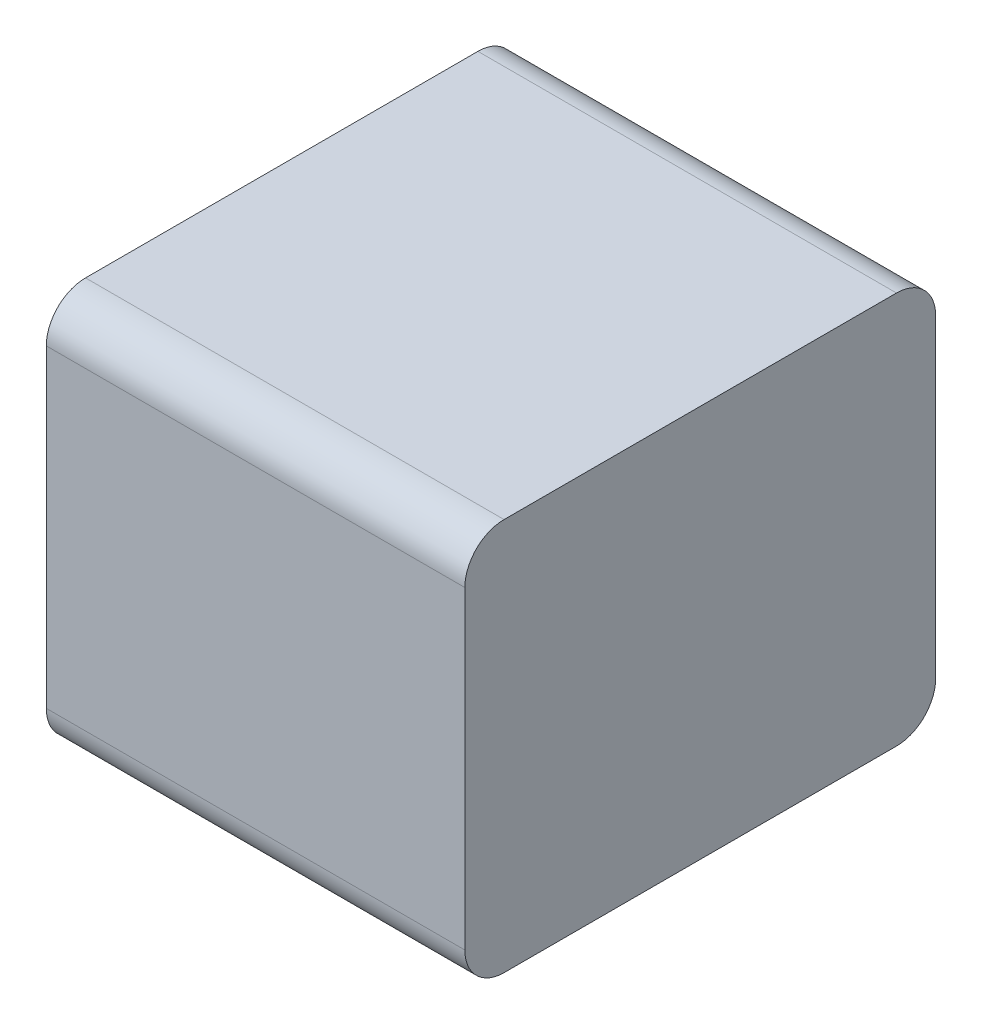
ISO-10303-21;
HEADER;
FILE_DESCRIPTION(('STEP AP214'),'2;1');
FILE_NAME('part.step','',(''),(''),'','','');
FILE_SCHEMA(('AUTOMOTIVE_DESIGN { 1 0 10303 214 1 1 1 1 }'));
ENDSEC;
DATA;
#1=APPLICATION_CONTEXT('core data for automotive mechanical design processes');
#2=APPLICATION_PROTOCOL_DEFINITION('international standard','automotive_design',2000,#1);
#3=PRODUCT_CONTEXT('',#1,'mechanical');
#4=PRODUCT('Part','Part','',(#3));
#5=PRODUCT_RELATED_PRODUCT_CATEGORY('part','',(#4));
#6=PRODUCT_DEFINITION_FORMATION('','',#4);
#7=PRODUCT_DEFINITION_CONTEXT('part definition',#1,'design');
#8=PRODUCT_DEFINITION('design','',#6,#7);
#9=PRODUCT_DEFINITION_SHAPE('','',#8);
#10=(LENGTH_UNIT() NAMED_UNIT(*) SI_UNIT(.MILLI.,.METRE.));
#11=(NAMED_UNIT(*) PLANE_ANGLE_UNIT() SI_UNIT($,.RADIAN.));
#12=(NAMED_UNIT(*) SI_UNIT($,.STERADIAN.) SOLID_ANGLE_UNIT());
#13=UNCERTAINTY_MEASURE_WITH_UNIT(LENGTH_MEASURE(1.E-05),#10,'distance_accuracy_value','');
#14=(GEOMETRIC_REPRESENTATION_CONTEXT(3) GLOBAL_UNCERTAINTY_ASSIGNED_CONTEXT((#13)) GLOBAL_UNIT_ASSIGNED_CONTEXT((#10,
#11,#12)) REPRESENTATION_CONTEXT('',''));
#15=CARTESIAN_POINT('',(0.,0.,0.));
#16=DIRECTION('',(0.,0.,1.));
#17=DIRECTION('',(1.,0.,0.));
#18=AXIS2_PLACEMENT_3D('',#15,#16,#17);
#19=CARTESIAN_POINT('',(0.4,0.3,0.1));
#20=DIRECTION('',(1.,0.,0.));
#21=DIRECTION('',(0.,-3.10439608047774E-10,-1.));
#22=AXIS2_PLACEMENT_3D('',#19,#20,#21);
#23=CYLINDRICAL_SURFACE('',#22,0.075);
#24=CARTESIAN_POINT('',(0.4,0.3,0.1));
#25=DIRECTION('',(1.,0.,0.));
#26=DIRECTION('',(0.,-3.10439608047774E-10,-1.));
#27=AXIS2_PLACEMENT_3D('',#24,#25,#26);
#28=CIRCLE('',#27,0.075);
#29=CARTESIAN_POINT('',(0.4,0.299999999977,0.025));
#30=VERTEX_POINT('',#29);
#31=CARTESIAN_POINT('',(0.4,0.375,0.09999999993597));
#32=VERTEX_POINT('',#31);
#33=EDGE_CURVE('E182',#30,#32,#28,.T.);
#34=ORIENTED_EDGE('',*,*,#33,.F.);
#35=DIRECTION('',(1.,0.,0.));
#36=VECTOR('',#35,1.);
#37=CARTESIAN_POINT('',(0.4,0.299999999977,0.025));
#38=LINE('',#37,#36);
#39=CARTESIAN_POINT('',(-0.4,0.299999999977,0.025));
#40=VERTEX_POINT('',#39);
#41=EDGE_CURVE('E185',#40,#30,#38,.T.);
#42=ORIENTED_EDGE('',*,*,#41,.F.);
#43=CARTESIAN_POINT('',(-0.4,0.3,0.1));
#44=DIRECTION('',(-1.,0.,0.));
#45=DIRECTION('',(0.,-3.10439608047774E-10,-1.));
#46=AXIS2_PLACEMENT_3D('',#43,#44,#45);
#47=CIRCLE('',#46,0.075);
#48=CARTESIAN_POINT('',(-0.4,0.375,0.09999999993597));
#49=VERTEX_POINT('',#48);
#50=EDGE_CURVE('E150',#49,#40,#47,.T.);
#51=ORIENTED_EDGE('',*,*,#50,.F.);
#52=DIRECTION('',(1.,0.,0.));
#53=VECTOR('',#52,1.);
#54=CARTESIAN_POINT('',(0.4,0.375,0.09999999993597));
#55=LINE('',#54,#53);
#56=EDGE_CURVE('E11',#49,#32,#55,.T.);
#57=ORIENTED_EDGE('',*,*,#56,.T.);
#58=EDGE_LOOP('',(#34,#42,#51,#57));
#59=FACE_BOUND('',#58,.T.);
#60=ADVANCED_FACE('F16',(#59),#23,.T.);
#61=CARTESIAN_POINT('',(0.4,0.375,0.09999999993597));
#62=DIRECTION('',(0.,1.,0.));
#63=DIRECTION('',(1.,0.,0.));
#64=AXIS2_PLACEMENT_3D('',#61,#62,#63);
#65=PLANE('',#64);
#66=DIRECTION('',(0.,0.,1.));
#67=VECTOR('',#66,1.);
#68=CARTESIAN_POINT('',(0.4,0.375,0.524999999968));
#69=LINE('',#68,#67);
#70=CARTESIAN_POINT('',(0.4,0.375,0.850000000052));
#71=VERTEX_POINT('',#70);
#72=EDGE_CURVE('E178',#32,#71,#69,.T.);
#73=ORIENTED_EDGE('',*,*,#72,.F.);
#74=ORIENTED_EDGE('',*,*,#56,.F.);
#75=DIRECTION('',(0.,0.,-1.));
#76=VECTOR('',#75,1.);
#77=CARTESIAN_POINT('',(-0.4,0.375,0.524999999968));
#78=LINE('',#77,#76);
#79=CARTESIAN_POINT('',(-0.4,0.375,0.850000000052));
#80=VERTEX_POINT('',#79);
#81=EDGE_CURVE('E170',#80,#49,#78,.T.);
#82=ORIENTED_EDGE('',*,*,#81,.F.);
#83=DIRECTION('',(1.,0.,0.));
#84=VECTOR('',#83,1.);
#85=CARTESIAN_POINT('',(0.4,0.375,0.850000000052));
#86=LINE('',#85,#84);
#87=EDGE_CURVE('E26',#80,#71,#86,.T.);
#88=ORIENTED_EDGE('',*,*,#87,.T.);
#89=EDGE_LOOP('',(#73,#74,#82,#88));
#90=FACE_BOUND('',#89,.T.);
#91=ADVANCED_FACE('F199',(#90),#65,.T.);
#92=CARTESIAN_POINT('',(0.4,0.3,0.85));
#93=DIRECTION('',(1.,0.,0.));
#94=DIRECTION('',(0.,1.,6.98493635616545E-10));
#95=AXIS2_PLACEMENT_3D('',#92,#93,#94);
#96=CYLINDRICAL_SURFACE('',#95,0.075);
#97=CARTESIAN_POINT('',(0.4,0.3,0.85));
#98=DIRECTION('',(1.,0.,0.));
#99=DIRECTION('',(0.,1.,6.98493635616545E-10));
#100=AXIS2_PLACEMENT_3D('',#97,#98,#99);
#101=CIRCLE('',#100,0.075);
#102=CARTESIAN_POINT('',(0.4,0.299999999977,0.925));
#103=VERTEX_POINT('',#102);
#104=EDGE_CURVE('E165',#71,#103,#101,.T.);
#105=ORIENTED_EDGE('',*,*,#104,.F.);
#106=ORIENTED_EDGE('',*,*,#87,.F.);
#107=CARTESIAN_POINT('',(-0.4,0.3,0.85));
#108=DIRECTION('',(-1.,0.,0.));
#109=DIRECTION('',(0.,1.,6.98493635616545E-10));
#110=AXIS2_PLACEMENT_3D('',#107,#108,#109);
#111=CIRCLE('',#110,0.075);
#112=CARTESIAN_POINT('',(-0.4,0.299999999977,0.925));
#113=VERTEX_POINT('',#112);
#114=EDGE_CURVE('E166',#113,#80,#111,.T.);
#115=ORIENTED_EDGE('',*,*,#114,.F.);
#116=DIRECTION('',(1.,0.,0.));
#117=VECTOR('',#116,1.);
#118=CARTESIAN_POINT('',(0.4,0.299999999977,0.925));
#119=LINE('',#118,#117);
#120=EDGE_CURVE('E41',#113,#103,#119,.T.);
#121=ORIENTED_EDGE('',*,*,#120,.T.);
#122=EDGE_LOOP('',(#105,#106,#115,#121));
#123=FACE_BOUND('',#122,.T.);
#124=ADVANCED_FACE('F196',(#123),#96,.T.);
#125=CARTESIAN_POINT('',(0.4,0.299999999977,0.925));
#126=DIRECTION('',(0.,0.,1.));
#127=DIRECTION('',(1.,0.,0.));
#128=AXIS2_PLACEMENT_3D('',#125,#126,#127);
#129=PLANE('',#128);
#130=DIRECTION('',(0.,-1.,0.));
#131=VECTOR('',#130,1.);
#132=CARTESIAN_POINT('',(0.4,-0.489832699321,0.925));
#133=LINE('',#132,#131);
#134=CARTESIAN_POINT('',(0.4,-0.3,0.925));
#135=VERTEX_POINT('',#134);
#136=EDGE_CURVE('E162',#103,#135,#133,.T.);
#137=ORIENTED_EDGE('',*,*,#136,.F.);
#138=ORIENTED_EDGE('',*,*,#120,.F.);
#139=DIRECTION('',(0.,1.,0.));
#140=VECTOR('',#139,1.);
#141=CARTESIAN_POINT('',(-0.4,0.789832699298,0.925));
#142=LINE('',#141,#140);
#143=CARTESIAN_POINT('',(-0.4,-0.3,0.925));
#144=VERTEX_POINT('',#143);
#145=EDGE_CURVE('E154',#144,#113,#142,.T.);
#146=ORIENTED_EDGE('',*,*,#145,.F.);
#147=DIRECTION('',(1.,0.,0.));
#148=VECTOR('',#147,1.);
#149=CARTESIAN_POINT('',(0.4,-0.3,0.925));
#150=LINE('',#149,#148);
#151=EDGE_CURVE('E107',#144,#135,#150,.T.);
#152=ORIENTED_EDGE('',*,*,#151,.T.);
#153=EDGE_LOOP('',(#137,#138,#146,#152));
#154=FACE_BOUND('',#153,.T.);
#155=ADVANCED_FACE('F198',(#154),#129,.T.);
#156=CARTESIAN_POINT('',(0.4,-0.3,0.85));
#157=DIRECTION('',(1.,0.,0.));
#158=DIRECTION('',(0.,0.,1.));
#159=AXIS2_PLACEMENT_3D('',#156,#157,#158);
#160=CYLINDRICAL_SURFACE('',#159,0.075);
#161=CARTESIAN_POINT('',(0.4,-0.3,0.85));
#162=DIRECTION('',(1.,0.,0.));
#163=DIRECTION('',(0.,0.,1.));
#164=AXIS2_PLACEMENT_3D('',#161,#162,#163);
#165=CIRCLE('',#164,0.075);
#166=CARTESIAN_POINT('',(0.4,-0.375,0.850000000052));
#167=VERTEX_POINT('',#166);
#168=EDGE_CURVE('E138',#135,#167,#165,.T.);
#169=ORIENTED_EDGE('',*,*,#168,.F.);
#170=ORIENTED_EDGE('',*,*,#151,.F.);
#171=CARTESIAN_POINT('',(-0.4,-0.3,0.85));
#172=DIRECTION('',(-1.,0.,0.));
#173=DIRECTION('',(0.,0.,1.));
#174=AXIS2_PLACEMENT_3D('',#171,#172,#173);
#175=CIRCLE('',#174,0.075);
#176=CARTESIAN_POINT('',(-0.4,-0.375,0.850000000052));
#177=VERTEX_POINT('',#176);
#178=EDGE_CURVE('E226',#177,#144,#175,.T.);
#179=ORIENTED_EDGE('',*,*,#178,.F.);
#180=DIRECTION('',(-1.,0.,0.));
#181=VECTOR('',#180,1.);
#182=CARTESIAN_POINT('',(0.4,-0.375,0.850000000052));
#183=LINE('',#182,#181);
#184=EDGE_CURVE('E129',#167,#177,#183,.T.);
#185=ORIENTED_EDGE('',*,*,#184,.F.);
#186=EDGE_LOOP('',(#169,#170,#179,#185));
#187=FACE_BOUND('',#186,.T.);
#188=ADVANCED_FACE('F206',(#187),#160,.T.);
#189=CARTESIAN_POINT('',(0.4,-0.3,0.025));
#190=DIRECTION('',(0.,0.,-1.));
#191=DIRECTION('',(0.,-1.,0.));
#192=AXIS2_PLACEMENT_3D('',#189,#190,#191);
#193=PLANE('',#192);
#194=DIRECTION('',(0.,1.,0.));
#195=VECTOR('',#194,1.);
#196=CARTESIAN_POINT('',(0.4,-0.789832699309,0.025));
#197=LINE('',#196,#195);
#198=CARTESIAN_POINT('',(0.4,-0.3,0.025));
#199=VERTEX_POINT('',#198);
#200=EDGE_CURVE('E158',#199,#30,#197,.T.);
#201=ORIENTED_EDGE('',*,*,#200,.F.);
#202=DIRECTION('',(1.,0.,0.));
#203=VECTOR('',#202,1.);
#204=CARTESIAN_POINT('',(0.4,-0.3,0.025));
#205=LINE('',#204,#203);
#206=CARTESIAN_POINT('',(-0.4,-0.3,0.025));
#207=VERTEX_POINT('',#206);
#208=EDGE_CURVE('E19',#207,#199,#205,.T.);
#209=ORIENTED_EDGE('',*,*,#208,.F.);
#210=DIRECTION('',(0.,-1.,0.));
#211=VECTOR('',#210,1.);
#212=CARTESIAN_POINT('',(-0.4,0.489832699309,0.025));
#213=LINE('',#212,#211);
#214=EDGE_CURVE('E143',#40,#207,#213,.T.);
#215=ORIENTED_EDGE('',*,*,#214,.F.);
#216=ORIENTED_EDGE('',*,*,#41,.T.);
#217=EDGE_LOOP('',(#201,#209,#215,#216));
#218=FACE_BOUND('',#217,.T.);
#219=ADVANCED_FACE('F330',(#218),#193,.T.);
#220=CARTESIAN_POINT('',(0.4,-0.3,0.1));
#221=DIRECTION('',(1.,0.,0.));
#222=DIRECTION('',(0.,-1.,-8.53713439640432E-10));
#223=AXIS2_PLACEMENT_3D('',#220,#221,#222);
#224=CYLINDRICAL_SURFACE('',#223,0.075);
#225=CARTESIAN_POINT('',(0.4,-0.3,0.1));
#226=DIRECTION('',(1.,0.,0.));
#227=DIRECTION('',(0.,-1.,-8.53713439640432E-10));
#228=AXIS2_PLACEMENT_3D('',#225,#226,#227);
#229=CIRCLE('',#228,0.075);
#230=CARTESIAN_POINT('',(0.4,-0.375,0.09999999993597));
#231=VERTEX_POINT('',#230);
#232=EDGE_CURVE('E124',#231,#199,#229,.T.);
#233=ORIENTED_EDGE('',*,*,#232,.F.);
#234=DIRECTION('',(1.,0.,0.));
#235=VECTOR('',#234,1.);
#236=CARTESIAN_POINT('',(0.4,-0.375,0.09999999993597));
#237=LINE('',#236,#235);
#238=CARTESIAN_POINT('',(-0.4,-0.375,0.09999999993597));
#239=VERTEX_POINT('',#238);
#240=EDGE_CURVE('E116',#239,#231,#237,.T.);
#241=ORIENTED_EDGE('',*,*,#240,.F.);
#242=CARTESIAN_POINT('',(-0.4,-0.3,0.1));
#243=DIRECTION('',(-1.,0.,0.));
#244=DIRECTION('',(0.,-1.,-8.53713439640432E-10));
#245=AXIS2_PLACEMENT_3D('',#242,#243,#244);
#246=CIRCLE('',#245,0.075);
#247=EDGE_CURVE('E121',#207,#239,#246,.T.);
#248=ORIENTED_EDGE('',*,*,#247,.F.);
#249=ORIENTED_EDGE('',*,*,#208,.T.);
#250=EDGE_LOOP('',(#233,#241,#248,#249));
#251=FACE_BOUND('',#250,.T.);
#252=ADVANCED_FACE('F118',(#251),#224,.T.);
#253=CARTESIAN_POINT('',(0.4,-0.375,0.850000000052));
#254=DIRECTION('',(0.,-1.,0.));
#255=DIRECTION('',(0.,0.,-1.));
#256=AXIS2_PLACEMENT_3D('',#253,#254,#255);
#257=PLANE('',#256);
#258=DIRECTION('',(0.,0.,-1.));
#259=VECTOR('',#258,1.);
#260=CARTESIAN_POINT('',(0.4,-0.375,0.900000000026));
#261=LINE('',#260,#259);
#262=EDGE_CURVE('E159',#167,#231,#261,.T.);
#263=ORIENTED_EDGE('',*,*,#262,.F.);
#264=ORIENTED_EDGE('',*,*,#184,.T.);
#265=DIRECTION('',(0.,0.,1.));
#266=VECTOR('',#265,1.);
#267=CARTESIAN_POINT('',(-0.4,-0.375,0.900000000026));
#268=LINE('',#267,#266);
#269=EDGE_CURVE('E132',#239,#177,#268,.T.);
#270=ORIENTED_EDGE('',*,*,#269,.F.);
#271=ORIENTED_EDGE('',*,*,#240,.T.);
#272=EDGE_LOOP('',(#263,#264,#270,#271));
#273=FACE_BOUND('',#272,.T.);
#274=ADVANCED_FACE('F133',(#273),#257,.T.);
#275=CARTESIAN_POINT('',(0.4,-1.279665398619,0.95));
#276=DIRECTION('',(1.,0.,0.));
#277=DIRECTION('',(0.,1.,0.));
#278=AXIS2_PLACEMENT_3D('',#275,#276,#277);
#279=PLANE('',#278);
#280=ORIENTED_EDGE('',*,*,#168,.T.);
#281=ORIENTED_EDGE('',*,*,#262,.T.);
#282=ORIENTED_EDGE('',*,*,#232,.T.);
#283=ORIENTED_EDGE('',*,*,#200,.T.);
#284=ORIENTED_EDGE('',*,*,#33,.T.);
#285=ORIENTED_EDGE('',*,*,#72,.T.);
#286=ORIENTED_EDGE('',*,*,#104,.T.);
#287=ORIENTED_EDGE('',*,*,#136,.T.);
#288=EDGE_LOOP('',(#280,#281,#282,#283,#284,#285,#286,#287));
#289=FACE_BOUND('',#288,.T.);
#290=ADVANCED_FACE('F193',(#289),#279,.T.);
#291=CARTESIAN_POINT('',(-0.4,1.279665398619,0.95));
#292=DIRECTION('',(-1.,0.,0.));
#293=DIRECTION('',(0.,0.,1.));
#294=AXIS2_PLACEMENT_3D('',#291,#292,#293);
#295=PLANE('',#294);
#296=ORIENTED_EDGE('',*,*,#178,.T.);
#297=ORIENTED_EDGE('',*,*,#145,.T.);
#298=ORIENTED_EDGE('',*,*,#114,.T.);
#299=ORIENTED_EDGE('',*,*,#81,.T.);
#300=ORIENTED_EDGE('',*,*,#50,.T.);
#301=ORIENTED_EDGE('',*,*,#214,.T.);
#302=ORIENTED_EDGE('',*,*,#247,.T.);
#303=ORIENTED_EDGE('',*,*,#269,.T.);
#304=EDGE_LOOP('',(#296,#297,#298,#299,#300,#301,#302,#303));
#305=FACE_BOUND('',#304,.T.);
#306=ADVANCED_FACE('F140',(#305),#295,.T.);
#307=CLOSED_SHELL('',(#60,#91,#124,#155,#188,#219,#252,#274,#290,#306));
#308=MANIFOLD_SOLID_BREP('B1',#307);
#309=ADVANCED_BREP_SHAPE_REPRESENTATION('',(#18,#308),#14);
#310=SHAPE_DEFINITION_REPRESENTATION(#9,#309);
ENDSEC;
END-ISO-10303-21;
